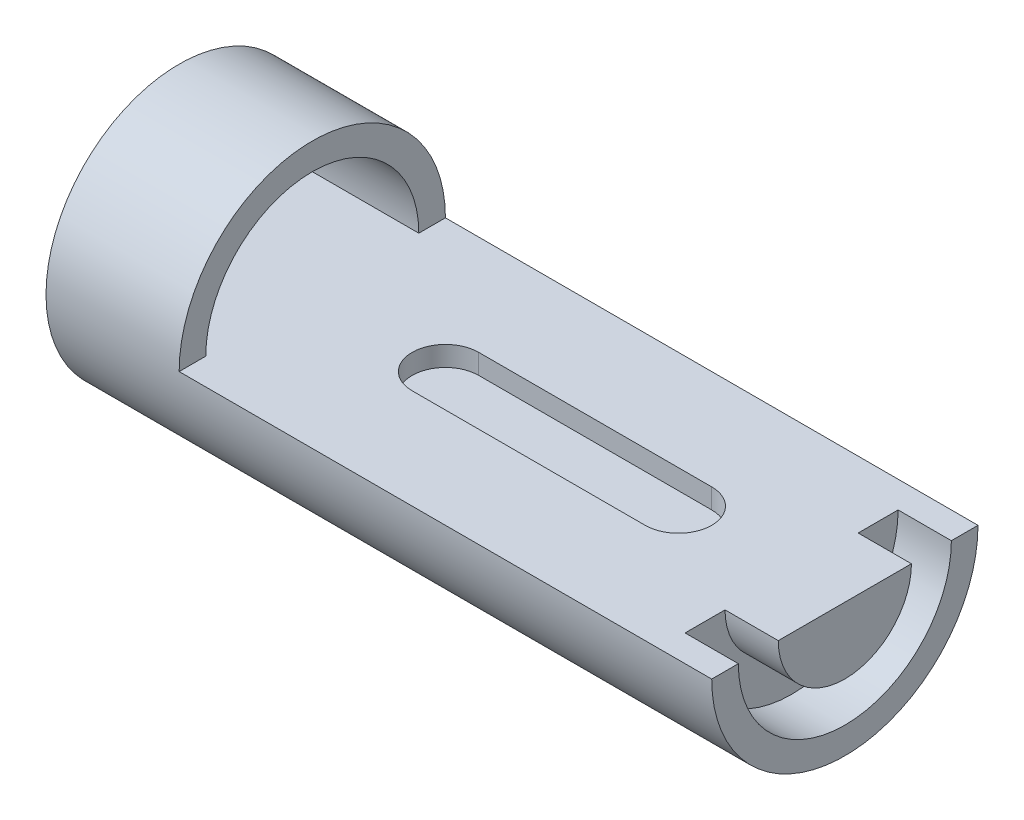
ISO-10303-21;
HEADER;
FILE_DESCRIPTION(('STEP AP214'),'2;1');
FILE_NAME('part.step','',(''),(''),'','','');
FILE_SCHEMA(('AUTOMOTIVE_DESIGN { 1 0 10303 214 1 1 1 1 }'));
ENDSEC;
DATA;
#1=APPLICATION_CONTEXT('core data for automotive mechanical design processes');
#2=APPLICATION_PROTOCOL_DEFINITION('international standard','automotive_design',2000,#1);
#3=PRODUCT_CONTEXT('',#1,'mechanical');
#4=PRODUCT('Part','Part','',(#3));
#5=PRODUCT_RELATED_PRODUCT_CATEGORY('part','',(#4));
#6=PRODUCT_DEFINITION_FORMATION('','',#4);
#7=PRODUCT_DEFINITION_CONTEXT('part definition',#1,'design');
#8=PRODUCT_DEFINITION('design','',#6,#7);
#9=PRODUCT_DEFINITION_SHAPE('','',#8);
#10=(LENGTH_UNIT() NAMED_UNIT(*) SI_UNIT(.MILLI.,.METRE.));
#11=(NAMED_UNIT(*) PLANE_ANGLE_UNIT() SI_UNIT($,.RADIAN.));
#12=(NAMED_UNIT(*) SI_UNIT($,.STERADIAN.) SOLID_ANGLE_UNIT());
#13=UNCERTAINTY_MEASURE_WITH_UNIT(LENGTH_MEASURE(1.E-05),#10,'distance_accuracy_value','');
#14=(GEOMETRIC_REPRESENTATION_CONTEXT(3) GLOBAL_UNCERTAINTY_ASSIGNED_CONTEXT((#13)) GLOBAL_UNIT_ASSIGNED_CONTEXT((#10,
#11,#12)) REPRESENTATION_CONTEXT('',''));
#15=CARTESIAN_POINT('',(0.,0.,0.));
#16=DIRECTION('',(0.,0.,1.));
#17=DIRECTION('',(1.,0.,0.));
#18=AXIS2_PLACEMENT_3D('',#15,#16,#17);
#19=CARTESIAN_POINT('',(0.,0.,0.));
#20=DIRECTION('',(1.,0.,0.));
#21=DIRECTION('',(0.,0.,-1.));
#22=AXIS2_PLACEMENT_3D('',#19,#20,#21);
#23=PLANE('',#22);
#24=CARTESIAN_POINT('',(0.,0.,0.));
#25=DIRECTION('',(1.,0.,0.));
#26=DIRECTION('',(0.,0.,-1.));
#27=AXIS2_PLACEMENT_3D('',#24,#25,#26);
#28=CIRCLE('',#27,20.);
#29=CARTESIAN_POINT('',(0.,0.,-20.));
#30=VERTEX_POINT('',#29);
#31=CARTESIAN_POINT('',(0.,0.,20.));
#32=VERTEX_POINT('',#31);
#33=EDGE_CURVE('E237',#30,#32,#28,.T.);
#34=ORIENTED_EDGE('',*,*,#33,.T.);
#35=DIRECTION('',(0.,0.,1.));
#36=VECTOR('',#35,1.);
#37=CARTESIAN_POINT('',(0.,0.,0.));
#38=LINE('',#37,#36);
#39=CARTESIAN_POINT('',(0.,0.,16.));
#40=VERTEX_POINT('',#39);
#41=EDGE_CURVE('E181',#40,#32,#38,.T.);
#42=ORIENTED_EDGE('',*,*,#41,.F.);
#43=CARTESIAN_POINT('',(0.,0.,0.));
#44=DIRECTION('',(1.,0.,0.));
#45=DIRECTION('',(0.,0.,-1.));
#46=AXIS2_PLACEMENT_3D('',#43,#44,#45);
#47=CIRCLE('',#46,16.);
#48=CARTESIAN_POINT('',(0.,0.,-16.));
#49=VERTEX_POINT('',#48);
#50=EDGE_CURVE('E234',#49,#40,#47,.T.);
#51=ORIENTED_EDGE('',*,*,#50,.F.);
#52=DIRECTION('',(0.,0.,-1.));
#53=VECTOR('',#52,1.);
#54=CARTESIAN_POINT('',(0.,0.,0.));
#55=LINE('',#54,#53);
#56=EDGE_CURVE('E189',#49,#30,#55,.T.);
#57=ORIENTED_EDGE('',*,*,#56,.T.);
#58=EDGE_LOOP('',(#34,#42,#51,#57));
#59=FACE_BOUND('',#58,.T.);
#60=ADVANCED_FACE('F57',(#59),#23,.T.);
#61=CARTESIAN_POINT('',(-20.,0.,0.));
#62=DIRECTION('',(1.,0.,0.));
#63=DIRECTION('',(0.,0.,-1.));
#64=AXIS2_PLACEMENT_3D('',#61,#62,#63);
#65=CYLINDRICAL_SURFACE('',#64,16.);
#66=ORIENTED_EDGE('',*,*,#50,.T.);
#67=DIRECTION('',(1.,0.,0.));
#68=VECTOR('',#67,1.);
#69=CARTESIAN_POINT('',(-20.,0.,16.));
#70=LINE('',#69,#68);
#71=CARTESIAN_POINT('',(-20.,0.,16.));
#72=VERTEX_POINT('',#71);
#73=EDGE_CURVE('E12',#72,#40,#70,.T.);
#74=ORIENTED_EDGE('',*,*,#73,.F.);
#75=CARTESIAN_POINT('',(-20.,0.,0.));
#76=DIRECTION('',(1.,0.,0.));
#77=DIRECTION('',(0.,0.,-1.));
#78=AXIS2_PLACEMENT_3D('',#75,#76,#77);
#79=CIRCLE('',#78,16.);
#80=CARTESIAN_POINT('',(-20.,0.,-16.));
#81=VERTEX_POINT('',#80);
#82=EDGE_CURVE('E233',#81,#72,#79,.T.);
#83=ORIENTED_EDGE('',*,*,#82,.F.);
#84=DIRECTION('',(1.,0.,0.));
#85=VECTOR('',#84,1.);
#86=CARTESIAN_POINT('',(-20.,0.,-16.));
#87=LINE('',#86,#85);
#88=EDGE_CURVE('E61',#81,#49,#87,.T.);
#89=ORIENTED_EDGE('',*,*,#88,.T.);
#90=EDGE_LOOP('',(#66,#74,#83,#89));
#91=FACE_BOUND('',#90,.T.);
#92=ADVANCED_FACE('F245',(#91),#65,.F.);
#93=CARTESIAN_POINT('',(-20.,0.,0.));
#94=DIRECTION('',(1.,0.,0.));
#95=DIRECTION('',(0.,0.,-1.));
#96=AXIS2_PLACEMENT_3D('',#93,#94,#95);
#97=CYLINDRICAL_SURFACE('',#96,20.);
#98=CARTESIAN_POINT('',(-20.,0.,0.));
#99=DIRECTION('',(1.,0.,0.));
#100=DIRECTION('',(0.,0.,-1.));
#101=AXIS2_PLACEMENT_3D('',#98,#99,#100);
#102=CIRCLE('',#101,20.);
#103=CARTESIAN_POINT('',(-20.,0.,-20.));
#104=VERTEX_POINT('',#103);
#105=EDGE_CURVE('E230',#104,#104,#102,.T.);
#106=ORIENTED_EDGE('',*,*,#105,.T.);
#107=EDGE_LOOP('',(#106));
#108=FACE_BOUND('',#107,.T.);
#109=ORIENTED_EDGE('',*,*,#33,.F.);
#110=DIRECTION('',(-1.,0.,0.));
#111=VECTOR('',#110,1.);
#112=CARTESIAN_POINT('',(80.,0.,-20.));
#113=LINE('',#112,#111);
#114=CARTESIAN_POINT('',(80.,0.,-20.));
#115=VERTEX_POINT('',#114);
#116=EDGE_CURVE('E201',#115,#30,#113,.T.);
#117=ORIENTED_EDGE('',*,*,#116,.F.);
#118=CARTESIAN_POINT('',(80.,0.,0.));
#119=DIRECTION('',(1.,0.,0.));
#120=DIRECTION('',(0.,0.,-1.));
#121=AXIS2_PLACEMENT_3D('',#118,#119,#120);
#122=CIRCLE('',#121,20.);
#123=CARTESIAN_POINT('',(80.,0.,20.));
#124=VERTEX_POINT('',#123);
#125=EDGE_CURVE('E191',#124,#115,#122,.T.);
#126=ORIENTED_EDGE('',*,*,#125,.F.);
#127=DIRECTION('',(-1.,0.,0.));
#128=VECTOR('',#127,1.);
#129=CARTESIAN_POINT('',(80.,0.,20.));
#130=LINE('',#129,#128);
#131=EDGE_CURVE('E203',#124,#32,#130,.T.);
#132=ORIENTED_EDGE('',*,*,#131,.T.);
#133=EDGE_LOOP('',(#109,#117,#126,#132));
#134=FACE_BOUND('',#133,.T.);
#135=ADVANCED_FACE('F59',(#108,#134),#97,.T.);
#136=CARTESIAN_POINT('',(-20.,0.,0.));
#137=DIRECTION('',(0.,-1.,0.));
#138=DIRECTION('',(0.,0.,-1.));
#139=AXIS2_PLACEMENT_3D('',#136,#137,#138);
#140=PLANE('',#139);
#141=DIRECTION('',(1.,0.,0.));
#142=VECTOR('',#141,1.);
#143=CARTESIAN_POINT('',(20.,0.,5.));
#144=LINE('',#143,#142);
#145=CARTESIAN_POINT('',(20.,0.,5.));
#146=VERTEX_POINT('',#145);
#147=CARTESIAN_POINT('',(55.,0.,5.));
#148=VERTEX_POINT('',#147);
#149=EDGE_CURVE('E175',#146,#148,#144,.T.);
#150=ORIENTED_EDGE('',*,*,#149,.F.);
#151=CARTESIAN_POINT('',(20.,0.,0.));
#152=DIRECTION('',(0.,1.,0.));
#153=DIRECTION('',(0.,0.,1.));
#154=AXIS2_PLACEMENT_3D('',#151,#152,#153);
#155=CIRCLE('',#154,5.);
#156=CARTESIAN_POINT('',(20.,0.,-5.));
#157=VERTEX_POINT('',#156);
#158=EDGE_CURVE('E72',#157,#146,#155,.T.);
#159=ORIENTED_EDGE('',*,*,#158,.F.);
#160=DIRECTION('',(-1.,0.,0.));
#161=VECTOR('',#160,1.);
#162=CARTESIAN_POINT('',(20.,0.,-5.));
#163=LINE('',#162,#161);
#164=CARTESIAN_POINT('',(55.,0.,-5.));
#165=VERTEX_POINT('',#164);
#166=EDGE_CURVE('E166',#165,#157,#163,.T.);
#167=ORIENTED_EDGE('',*,*,#166,.F.);
#168=CARTESIAN_POINT('',(55.,0.,0.));
#169=DIRECTION('',(0.,1.,0.));
#170=DIRECTION('',(0.,0.,1.));
#171=AXIS2_PLACEMENT_3D('',#168,#169,#170);
#172=CIRCLE('',#171,5.);
#173=EDGE_CURVE('E169',#148,#165,#172,.T.);
#174=ORIENTED_EDGE('',*,*,#173,.F.);
#175=EDGE_LOOP('',(#150,#159,#167,#174));
#176=FACE_BOUND('',#175,.T.);
#177=ORIENTED_EDGE('',*,*,#73,.T.);
#178=ORIENTED_EDGE('',*,*,#41,.T.);
#179=ORIENTED_EDGE('',*,*,#131,.F.);
#180=DIRECTION('',(0.,0.,1.));
#181=VECTOR('',#180,1.);
#182=CARTESIAN_POINT('',(80.,0.,0.));
#183=LINE('',#182,#181);
#184=CARTESIAN_POINT('',(80.,0.,16.));
#185=VERTEX_POINT('',#184);
#186=EDGE_CURVE('E188',#185,#124,#183,.T.);
#187=ORIENTED_EDGE('',*,*,#186,.F.);
#188=DIRECTION('',(-1.,0.,0.));
#189=VECTOR('',#188,1.);
#190=CARTESIAN_POINT('',(80.,0.,16.));
#191=LINE('',#190,#189);
#192=CARTESIAN_POINT('',(72.,0.,16.));
#193=VERTEX_POINT('',#192);
#194=EDGE_CURVE('E206',#185,#193,#191,.T.);
#195=ORIENTED_EDGE('',*,*,#194,.T.);
#196=DIRECTION('',(0.,0.,-1.));
#197=VECTOR('',#196,1.);
#198=CARTESIAN_POINT('',(72.,0.,0.));
#199=LINE('',#198,#197);
#200=CARTESIAN_POINT('',(72.,0.,10.));
#201=VERTEX_POINT('',#200);
#202=EDGE_CURVE('E223',#193,#201,#199,.T.);
#203=ORIENTED_EDGE('',*,*,#202,.T.);
#204=DIRECTION('',(-1.,0.,0.));
#205=VECTOR('',#204,1.);
#206=CARTESIAN_POINT('',(80.,0.,10.));
#207=LINE('',#206,#205);
#208=CARTESIAN_POINT('',(80.,0.,10.));
#209=VERTEX_POINT('',#208);
#210=EDGE_CURVE('E217',#209,#201,#207,.T.);
#211=ORIENTED_EDGE('',*,*,#210,.F.);
#212=DIRECTION('',(0.,0.,-1.));
#213=VECTOR('',#212,1.);
#214=CARTESIAN_POINT('',(80.,0.,0.));
#215=LINE('',#214,#213);
#216=CARTESIAN_POINT('',(80.,0.,-10.));
#217=VERTEX_POINT('',#216);
#218=EDGE_CURVE('E209',#209,#217,#215,.T.);
#219=ORIENTED_EDGE('',*,*,#218,.T.);
#220=DIRECTION('',(-1.,0.,0.));
#221=VECTOR('',#220,1.);
#222=CARTESIAN_POINT('',(80.,0.,-10.));
#223=LINE('',#222,#221);
#224=CARTESIAN_POINT('',(72.,0.,-10.));
#225=VERTEX_POINT('',#224);
#226=EDGE_CURVE('E214',#217,#225,#223,.T.);
#227=ORIENTED_EDGE('',*,*,#226,.T.);
#228=CARTESIAN_POINT('',(72.,0.,-16.));
#229=VERTEX_POINT('',#228);
#230=EDGE_CURVE('E227',#225,#229,#199,.T.);
#231=ORIENTED_EDGE('',*,*,#230,.T.);
#232=DIRECTION('',(-1.,0.,0.));
#233=VECTOR('',#232,1.);
#234=CARTESIAN_POINT('',(80.,0.,-16.));
#235=LINE('',#234,#233);
#236=CARTESIAN_POINT('',(80.,0.,-16.));
#237=VERTEX_POINT('',#236);
#238=EDGE_CURVE('E196',#237,#229,#235,.T.);
#239=ORIENTED_EDGE('',*,*,#238,.F.);
#240=DIRECTION('',(0.,0.,-1.));
#241=VECTOR('',#240,1.);
#242=CARTESIAN_POINT('',(80.,0.,0.));
#243=LINE('',#242,#241);
#244=EDGE_CURVE('E193',#237,#115,#243,.T.);
#245=ORIENTED_EDGE('',*,*,#244,.T.);
#246=ORIENTED_EDGE('',*,*,#116,.T.);
#247=ORIENTED_EDGE('',*,*,#56,.F.);
#248=ORIENTED_EDGE('',*,*,#88,.F.);
#249=DIRECTION('',(0.,0.,-1.));
#250=VECTOR('',#249,1.);
#251=CARTESIAN_POINT('',(-20.,0.,0.));
#252=LINE('',#251,#250);
#253=EDGE_CURVE('E79',#72,#81,#252,.T.);
#254=ORIENTED_EDGE('',*,*,#253,.F.);
#255=EDGE_LOOP('',(#177,#178,#179,#187,#195,#203,#211,#219,#227,#231,#239,#245,#246,#247,#248,#254));
#256=FACE_BOUND('',#255,.T.);
#257=ADVANCED_FACE('F250',(#176,#256),#140,.F.);
#258=CARTESIAN_POINT('',(-20.,0.,0.));
#259=DIRECTION('',(1.,0.,0.));
#260=DIRECTION('',(0.,0.,-1.));
#261=AXIS2_PLACEMENT_3D('',#258,#259,#260);
#262=PLANE('',#261);
#263=ORIENTED_EDGE('',*,*,#105,.F.);
#264=EDGE_LOOP('',(#263));
#265=FACE_BOUND('',#264,.T.);
#266=ORIENTED_EDGE('',*,*,#82,.T.);
#267=ORIENTED_EDGE('',*,*,#253,.T.);
#268=EDGE_LOOP('',(#266,#267));
#269=FACE_BOUND('',#268,.T.);
#270=ADVANCED_FACE('F252',(#265,#269),#262,.F.);
#271=CARTESIAN_POINT('',(72.,0.,0.));
#272=DIRECTION('',(1.,0.,0.));
#273=DIRECTION('',(0.,0.,-1.));
#274=AXIS2_PLACEMENT_3D('',#271,#272,#273);
#275=PLANE('',#274);
#276=CARTESIAN_POINT('',(72.,0.,0.));
#277=DIRECTION('',(1.,0.,0.));
#278=DIRECTION('',(0.,0.,-1.));
#279=AXIS2_PLACEMENT_3D('',#276,#277,#278);
#280=CIRCLE('',#279,10.);
#281=EDGE_CURVE('E220',#201,#225,#280,.T.);
#282=ORIENTED_EDGE('',*,*,#281,.F.);
#283=ORIENTED_EDGE('',*,*,#202,.F.);
#284=CARTESIAN_POINT('',(72.,0.,0.));
#285=DIRECTION('',(1.,0.,0.));
#286=DIRECTION('',(0.,0.,-1.));
#287=AXIS2_PLACEMENT_3D('',#284,#285,#286);
#288=CIRCLE('',#287,16.);
#289=EDGE_CURVE('E226',#193,#229,#288,.T.);
#290=ORIENTED_EDGE('',*,*,#289,.T.);
#291=ORIENTED_EDGE('',*,*,#230,.F.);
#292=EDGE_LOOP('',(#282,#283,#290,#291));
#293=FACE_BOUND('',#292,.T.);
#294=ADVANCED_FACE('F259',(#293),#275,.T.);
#295=CARTESIAN_POINT('',(80.,0.,0.));
#296=DIRECTION('',(-1.,0.,0.));
#297=DIRECTION('',(0.,0.,1.));
#298=AXIS2_PLACEMENT_3D('',#295,#296,#297);
#299=CYLINDRICAL_SURFACE('',#298,10.);
#300=ORIENTED_EDGE('',*,*,#281,.T.);
#301=ORIENTED_EDGE('',*,*,#226,.F.);
#302=CARTESIAN_POINT('',(80.,0.,0.));
#303=DIRECTION('',(1.,0.,0.));
#304=DIRECTION('',(0.,0.,-1.));
#305=AXIS2_PLACEMENT_3D('',#302,#303,#304);
#306=CIRCLE('',#305,10.);
#307=EDGE_CURVE('E212',#209,#217,#306,.T.);
#308=ORIENTED_EDGE('',*,*,#307,.F.);
#309=ORIENTED_EDGE('',*,*,#210,.T.);
#310=EDGE_LOOP('',(#300,#301,#308,#309));
#311=FACE_BOUND('',#310,.T.);
#312=ADVANCED_FACE('F271',(#311),#299,.T.);
#313=CARTESIAN_POINT('',(80.,0.,0.));
#314=DIRECTION('',(1.,0.,0.));
#315=DIRECTION('',(0.,0.,-1.));
#316=AXIS2_PLACEMENT_3D('',#313,#314,#315);
#317=PLANE('',#316);
#318=ORIENTED_EDGE('',*,*,#218,.F.);
#319=ORIENTED_EDGE('',*,*,#307,.T.);
#320=EDGE_LOOP('',(#318,#319));
#321=FACE_BOUND('',#320,.T.);
#322=ADVANCED_FACE('F275',(#321),#317,.T.);
#323=CARTESIAN_POINT('',(80.,0.,0.));
#324=DIRECTION('',(-1.,0.,0.));
#325=DIRECTION('',(0.,0.,1.));
#326=AXIS2_PLACEMENT_3D('',#323,#324,#325);
#327=CYLINDRICAL_SURFACE('',#326,16.);
#328=ORIENTED_EDGE('',*,*,#238,.T.);
#329=ORIENTED_EDGE('',*,*,#289,.F.);
#330=ORIENTED_EDGE('',*,*,#194,.F.);
#331=CARTESIAN_POINT('',(80.,0.,0.));
#332=DIRECTION('',(1.,0.,0.));
#333=DIRECTION('',(0.,0.,-1.));
#334=AXIS2_PLACEMENT_3D('',#331,#332,#333);
#335=CIRCLE('',#334,16.);
#336=EDGE_CURVE('E185',#185,#237,#335,.T.);
#337=ORIENTED_EDGE('',*,*,#336,.T.);
#338=EDGE_LOOP('',(#328,#329,#330,#337));
#339=FACE_BOUND('',#338,.T.);
#340=ADVANCED_FACE('F279',(#339),#327,.F.);
#341=CARTESIAN_POINT('',(80.,0.,0.));
#342=DIRECTION('',(1.,0.,0.));
#343=DIRECTION('',(0.,0.,-1.));
#344=AXIS2_PLACEMENT_3D('',#341,#342,#343);
#345=PLANE('',#344);
#346=ORIENTED_EDGE('',*,*,#336,.F.);
#347=ORIENTED_EDGE('',*,*,#186,.T.);
#348=ORIENTED_EDGE('',*,*,#125,.T.);
#349=ORIENTED_EDGE('',*,*,#244,.F.);
#350=EDGE_LOOP('',(#346,#347,#348,#349));
#351=FACE_BOUND('',#350,.T.);
#352=ADVANCED_FACE('F283',(#351),#345,.T.);
#353=CARTESIAN_POINT('',(20.,-3.,0.));
#354=DIRECTION('',(0.,1.,0.));
#355=DIRECTION('',(0.,0.,1.));
#356=AXIS2_PLACEMENT_3D('',#353,#354,#355);
#357=CYLINDRICAL_SURFACE('',#356,5.);
#358=ORIENTED_EDGE('',*,*,#158,.T.);
#359=DIRECTION('',(0.,1.,0.));
#360=VECTOR('',#359,1.);
#361=CARTESIAN_POINT('',(20.,-3.,5.));
#362=LINE('',#361,#360);
#363=CARTESIAN_POINT('',(20.,-3.,5.));
#364=VERTEX_POINT('',#363);
#365=EDGE_CURVE('E144',#364,#146,#362,.T.);
#366=ORIENTED_EDGE('',*,*,#365,.F.);
#367=CARTESIAN_POINT('',(20.,-3.,0.));
#368=DIRECTION('',(0.,1.,0.));
#369=DIRECTION('',(0.,0.,1.));
#370=AXIS2_PLACEMENT_3D('',#367,#368,#369);
#371=CIRCLE('',#370,5.);
#372=CARTESIAN_POINT('',(20.,-3.,-5.));
#373=VERTEX_POINT('',#372);
#374=EDGE_CURVE('E148',#373,#364,#371,.T.);
#375=ORIENTED_EDGE('',*,*,#374,.F.);
#376=DIRECTION('',(0.,1.,0.));
#377=VECTOR('',#376,1.);
#378=CARTESIAN_POINT('',(20.,-3.,-5.));
#379=LINE('',#378,#377);
#380=EDGE_CURVE('E179',#373,#157,#379,.T.);
#381=ORIENTED_EDGE('',*,*,#380,.T.);
#382=EDGE_LOOP('',(#358,#366,#375,#381));
#383=FACE_BOUND('',#382,.T.);
#384=ADVANCED_FACE('F146',(#383),#357,.F.);
#385=CARTESIAN_POINT('',(20.,-3.,-5.));
#386=DIRECTION('',(0.,0.,-1.));
#387=DIRECTION('',(-1.,0.,0.));
#388=AXIS2_PLACEMENT_3D('',#385,#386,#387);
#389=PLANE('',#388);
#390=ORIENTED_EDGE('',*,*,#166,.T.);
#391=ORIENTED_EDGE('',*,*,#380,.F.);
#392=DIRECTION('',(-1.,0.,0.));
#393=VECTOR('',#392,1.);
#394=CARTESIAN_POINT('',(20.,-3.,-5.));
#395=LINE('',#394,#393);
#396=CARTESIAN_POINT('',(55.,-3.,-5.));
#397=VERTEX_POINT('',#396);
#398=EDGE_CURVE('E154',#397,#373,#395,.T.);
#399=ORIENTED_EDGE('',*,*,#398,.F.);
#400=DIRECTION('',(0.,1.,0.));
#401=VECTOR('',#400,1.);
#402=CARTESIAN_POINT('',(55.,-3.,-5.));
#403=LINE('',#402,#401);
#404=EDGE_CURVE('E182',#397,#165,#403,.T.);
#405=ORIENTED_EDGE('',*,*,#404,.T.);
#406=EDGE_LOOP('',(#390,#391,#399,#405));
#407=FACE_BOUND('',#406,.T.);
#408=ADVANCED_FACE('F290',(#407),#389,.F.);
#409=CARTESIAN_POINT('',(55.,-3.,0.));
#410=DIRECTION('',(0.,1.,0.));
#411=DIRECTION('',(0.,0.,1.));
#412=AXIS2_PLACEMENT_3D('',#409,#410,#411);
#413=CYLINDRICAL_SURFACE('',#412,5.);
#414=ORIENTED_EDGE('',*,*,#173,.T.);
#415=ORIENTED_EDGE('',*,*,#404,.F.);
#416=CARTESIAN_POINT('',(55.,-3.,0.));
#417=DIRECTION('',(0.,1.,0.));
#418=DIRECTION('',(0.,0.,1.));
#419=AXIS2_PLACEMENT_3D('',#416,#417,#418);
#420=CIRCLE('',#419,5.);
#421=CARTESIAN_POINT('',(55.,-3.,5.));
#422=VERTEX_POINT('',#421);
#423=EDGE_CURVE('E162',#422,#397,#420,.T.);
#424=ORIENTED_EDGE('',*,*,#423,.F.);
#425=DIRECTION('',(0.,1.,0.));
#426=VECTOR('',#425,1.);
#427=CARTESIAN_POINT('',(55.,-3.,5.));
#428=LINE('',#427,#426);
#429=EDGE_CURVE('E153',#422,#148,#428,.T.);
#430=ORIENTED_EDGE('',*,*,#429,.T.);
#431=EDGE_LOOP('',(#414,#415,#424,#430));
#432=FACE_BOUND('',#431,.T.);
#433=ADVANCED_FACE('F293',(#432),#413,.F.);
#434=CARTESIAN_POINT('',(20.,-3.,5.));
#435=DIRECTION('',(0.,0.,1.));
#436=DIRECTION('',(1.,0.,0.));
#437=AXIS2_PLACEMENT_3D('',#434,#435,#436);
#438=PLANE('',#437);
#439=ORIENTED_EDGE('',*,*,#149,.T.);
#440=ORIENTED_EDGE('',*,*,#429,.F.);
#441=DIRECTION('',(1.,0.,0.));
#442=VECTOR('',#441,1.);
#443=CARTESIAN_POINT('',(20.,-3.,5.));
#444=LINE('',#443,#442);
#445=EDGE_CURVE('E157',#364,#422,#444,.T.);
#446=ORIENTED_EDGE('',*,*,#445,.F.);
#447=ORIENTED_EDGE('',*,*,#365,.T.);
#448=EDGE_LOOP('',(#439,#440,#446,#447));
#449=FACE_BOUND('',#448,.T.);
#450=ADVANCED_FACE('F158',(#449),#438,.F.);
#451=CARTESIAN_POINT('',(20.,-3.,0.));
#452=DIRECTION('',(0.,1.,0.));
#453=DIRECTION('',(0.,0.,1.));
#454=AXIS2_PLACEMENT_3D('',#451,#452,#453);
#455=PLANE('',#454);
#456=ORIENTED_EDGE('',*,*,#374,.T.);
#457=ORIENTED_EDGE('',*,*,#445,.T.);
#458=ORIENTED_EDGE('',*,*,#423,.T.);
#459=ORIENTED_EDGE('',*,*,#398,.T.);
#460=EDGE_LOOP('',(#456,#457,#458,#459));
#461=FACE_BOUND('',#460,.T.);
#462=ADVANCED_FACE('F164',(#461),#455,.T.);
#463=CLOSED_SHELL('',(#60,#92,#135,#257,#270,#294,#312,#322,#340,#352,#384,#408,#433,#450,#462));
#464=MANIFOLD_SOLID_BREP('B2',#463);
#465=ADVANCED_BREP_SHAPE_REPRESENTATION('',(#18,#464),#14);
#466=SHAPE_DEFINITION_REPRESENTATION(#9,#465);
ENDSEC;
END-ISO-10303-21;
